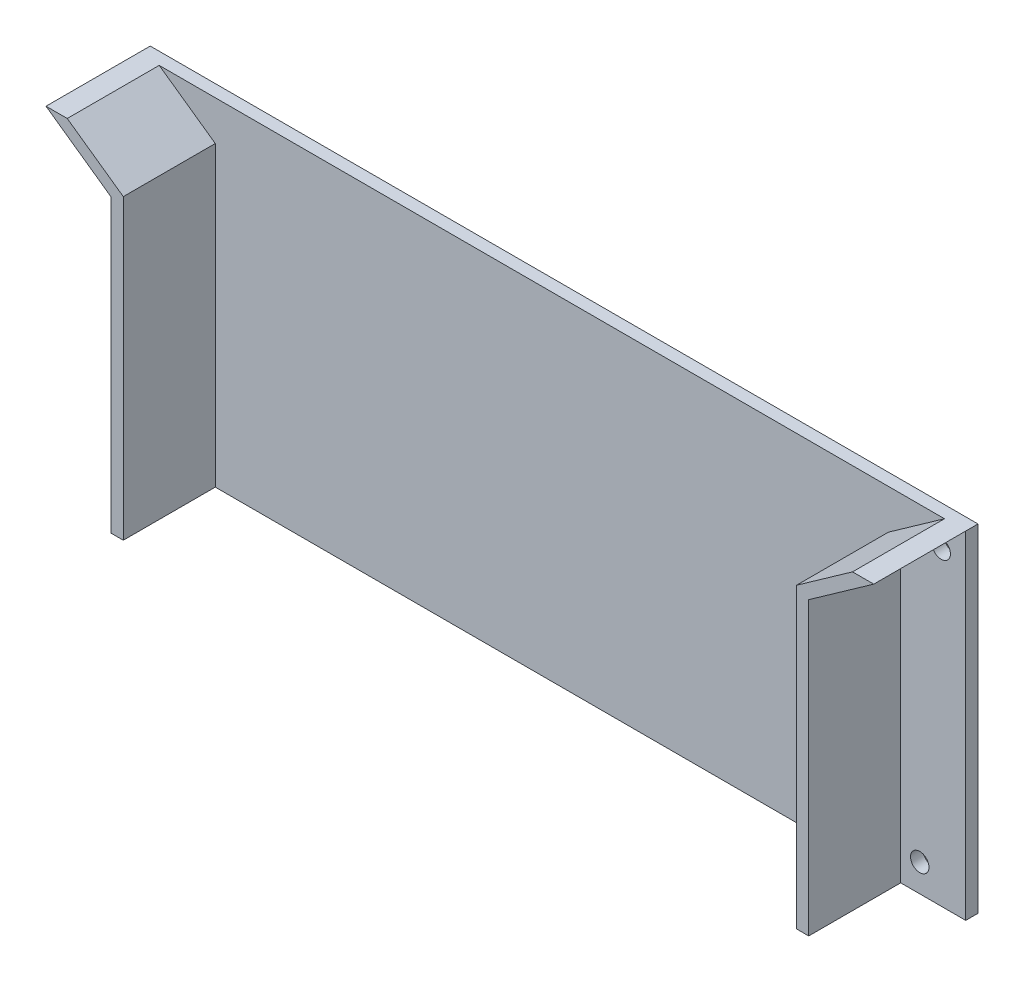
ISO-10303-21;
HEADER;
FILE_DESCRIPTION(('STEP AP214'),'2;1');
FILE_NAME('part.step','',(''),(''),'','','');
FILE_SCHEMA(('AUTOMOTIVE_DESIGN { 1 0 10303 214 1 1 1 1 }'));
ENDSEC;
DATA;
#1=APPLICATION_CONTEXT('core data for automotive mechanical design processes');
#2=APPLICATION_PROTOCOL_DEFINITION('international standard','automotive_design',2000,#1);
#3=PRODUCT_CONTEXT('',#1,'mechanical');
#4=PRODUCT('Part','Part','',(#3));
#5=PRODUCT_RELATED_PRODUCT_CATEGORY('part','',(#4));
#6=PRODUCT_DEFINITION_FORMATION('','',#4);
#7=PRODUCT_DEFINITION_CONTEXT('part definition',#1,'design');
#8=PRODUCT_DEFINITION('design','',#6,#7);
#9=PRODUCT_DEFINITION_SHAPE('','',#8);
#10=(LENGTH_UNIT() NAMED_UNIT(*) SI_UNIT(.MILLI.,.METRE.));
#11=(NAMED_UNIT(*) PLANE_ANGLE_UNIT() SI_UNIT($,.RADIAN.));
#12=(NAMED_UNIT(*) SI_UNIT($,.STERADIAN.) SOLID_ANGLE_UNIT());
#13=UNCERTAINTY_MEASURE_WITH_UNIT(LENGTH_MEASURE(1.E-05),#10,'distance_accuracy_value','');
#14=(GEOMETRIC_REPRESENTATION_CONTEXT(3) GLOBAL_UNCERTAINTY_ASSIGNED_CONTEXT((#13)) GLOBAL_UNIT_ASSIGNED_CONTEXT((#10,
#11,#12)) REPRESENTATION_CONTEXT('',''));
#15=CARTESIAN_POINT('',(0.,0.,0.));
#16=DIRECTION('',(0.,0.,1.));
#17=DIRECTION('',(1.,0.,0.));
#18=AXIS2_PLACEMENT_3D('',#15,#16,#17);
#19=CARTESIAN_POINT('',(0.,0.,4.));
#20=DIRECTION('',(0.,0.,1.));
#21=DIRECTION('',(1.,0.,0.));
#22=AXIS2_PLACEMENT_3D('',#19,#20,#21);
#23=PLANE('',#22);
#24=DIRECTION('',(-0.816523227975285,0.577312582728647,0.));
#25=VECTOR('',#24,1.);
#26=CARTESIAN_POINT('',(-128.071344502671,55.,4.));
#27=LINE('',#26,#25);
#28=CARTESIAN_POINT('',(-109.784719429221,42.0706694079946,4.));
#29=VERTEX_POINT('',#28);
#30=CARTESIAN_POINT('',(-128.071344502671,55.,4.));
#31=VERTEX_POINT('',#30);
#32=EDGE_CURVE('E182',#29,#31,#27,.T.);
#33=ORIENTED_EDGE('',*,*,#32,.F.);
#34=DIRECTION('',(0.,1.,0.));
#35=VECTOR('',#34,1.);
#36=CARTESIAN_POINT('',(-109.784719429221,42.0706694079946,4.));
#37=LINE('',#36,#35);
#38=CARTESIAN_POINT('',(-109.784719429221,-55.,4.));
#39=VERTEX_POINT('',#38);
#40=EDGE_CURVE('E185',#39,#29,#37,.T.);
#41=ORIENTED_EDGE('',*,*,#40,.F.);
#42=DIRECTION('',(1.,0.,0.));
#43=VECTOR('',#42,1.);
#44=CARTESIAN_POINT('',(-135.,-55.,4.));
#45=LINE('',#44,#43);
#46=CARTESIAN_POINT('',(109.784719429221,-55.,4.));
#47=VERTEX_POINT('',#46);
#48=EDGE_CURVE('E246',#39,#47,#45,.T.);
#49=ORIENTED_EDGE('',*,*,#48,.T.);
#50=DIRECTION('',(0.,-1.,0.));
#51=VECTOR('',#50,1.);
#52=CARTESIAN_POINT('',(109.784719429221,42.0706694079946,4.));
#53=LINE('',#52,#51);
#54=CARTESIAN_POINT('',(109.784719429221,42.0706694079946,4.));
#55=VERTEX_POINT('',#54);
#56=EDGE_CURVE('E281',#55,#47,#53,.T.);
#57=ORIENTED_EDGE('',*,*,#56,.F.);
#58=DIRECTION('',(-0.816523227975285,-0.577312582728647,0.));
#59=VECTOR('',#58,1.);
#60=CARTESIAN_POINT('',(128.071344502671,55.,4.));
#61=LINE('',#60,#59);
#62=CARTESIAN_POINT('',(128.071344502671,55.0000000000001,4.));
#63=VERTEX_POINT('',#62);
#64=EDGE_CURVE('E284',#63,#55,#61,.T.);
#65=ORIENTED_EDGE('',*,*,#64,.F.);
#66=DIRECTION('',(-1.,0.,0.));
#67=VECTOR('',#66,1.);
#68=CARTESIAN_POINT('',(-135.,55.,4.));
#69=LINE('',#68,#67);
#70=EDGE_CURVE('E250',#63,#31,#69,.T.);
#71=ORIENTED_EDGE('',*,*,#70,.T.);
#72=EDGE_LOOP('',(#33,#41,#49,#57,#65,#71));
#73=FACE_BOUND('',#72,.T.);
#74=ADVANCED_FACE('F33',(#73),#23,.T.);
#75=CARTESIAN_POINT('',(-127.,46.,4.));
#76=DIRECTION('',(0.,0.,1.));
#77=DIRECTION('',(1.,0.,0.));
#78=AXIS2_PLACEMENT_3D('',#75,#76,#77);
#79=CIRCLE('',#78,3.00000000000001);
#80=CARTESIAN_POINT('',(-126.43905459309,48.9470901327354,4.));
#81=VERTEX_POINT('',#80);
#82=CARTESIAN_POINT('',(-124.408578092933,47.5114670024764,4.));
#83=VERTEX_POINT('',#82);
#84=EDGE_CURVE('E163',#81,#83,#79,.T.);
#85=ORIENTED_EDGE('',*,*,#84,.F.);
#86=DIRECTION('',(0.816523227975285,-0.577312582728647,0.));
#87=VECTOR('',#86,1.);
#88=CARTESIAN_POINT('',(-135.,55.,4.));
#89=LINE('',#88,#87);
#90=CARTESIAN_POINT('',(-135.,55.,4.));
#91=VERTEX_POINT('',#90);
#92=EDGE_CURVE('E156',#91,#81,#89,.T.);
#93=ORIENTED_EDGE('',*,*,#92,.F.);
#94=DIRECTION('',(0.,-1.,0.));
#95=VECTOR('',#94,1.);
#96=CARTESIAN_POINT('',(-135.,55.,4.));
#97=LINE('',#96,#95);
#98=CARTESIAN_POINT('',(-135.,-55.,4.));
#99=VERTEX_POINT('',#98);
#100=EDGE_CURVE('E248',#91,#99,#97,.T.);
#101=ORIENTED_EDGE('',*,*,#100,.T.);
#102=CARTESIAN_POINT('',(-113.784719429221,-55.,4.));
#103=VERTEX_POINT('',#102);
#104=EDGE_CURVE('E233',#99,#103,#45,.T.);
#105=ORIENTED_EDGE('',*,*,#104,.T.);
#106=DIRECTION('',(0.,-1.,0.));
#107=VECTOR('',#106,1.);
#108=CARTESIAN_POINT('',(-113.784719429221,40.,4.));
#109=LINE('',#108,#107);
#110=CARTESIAN_POINT('',(-113.784719429221,40.,4.));
#111=VERTEX_POINT('',#110);
#112=EDGE_CURVE('E177',#111,#103,#109,.T.);
#113=ORIENTED_EDGE('',*,*,#112,.F.);
#114=EDGE_CURVE('E157',#83,#111,#89,.T.);
#115=ORIENTED_EDGE('',*,*,#114,.F.);
#116=EDGE_LOOP('',(#85,#93,#101,#105,#113,#115));
#117=FACE_BOUND('',#116,.T.);
#118=CARTESIAN_POINT('',(-120.,-46.,4.));
#119=DIRECTION('',(0.,0.,1.));
#120=DIRECTION('',(1.,0.,0.));
#121=AXIS2_PLACEMENT_3D('',#118,#119,#120);
#122=CIRCLE('',#121,3.00000000000001);
#123=CARTESIAN_POINT('',(-117.,-46.,4.));
#124=VERTEX_POINT('',#123);
#125=EDGE_CURVE('E207',#124,#124,#122,.T.);
#126=ORIENTED_EDGE('',*,*,#125,.F.);
#127=EDGE_LOOP('',(#126));
#128=FACE_BOUND('',#127,.T.);
#129=ADVANCED_FACE('F168',(#117,#128),#23,.T.);
#130=CARTESIAN_POINT('',(120.,-46.,4.));
#131=DIRECTION('',(0.,0.,1.));
#132=DIRECTION('',(1.,0.,0.));
#133=AXIS2_PLACEMENT_3D('',#130,#131,#132);
#134=CIRCLE('',#133,3.00000000000002);
#135=CARTESIAN_POINT('',(123.,-46.,4.));
#136=VERTEX_POINT('',#135);
#137=EDGE_CURVE('E211',#136,#136,#134,.T.);
#138=ORIENTED_EDGE('',*,*,#137,.F.);
#139=EDGE_LOOP('',(#138));
#140=FACE_BOUND('',#139,.T.);
#141=CARTESIAN_POINT('',(127.,46.,4.));
#142=DIRECTION('',(0.,0.,1.));
#143=DIRECTION('',(1.,0.,0.));
#144=AXIS2_PLACEMENT_3D('',#141,#142,#143);
#145=CIRCLE('',#144,2.99999999999999);
#146=CARTESIAN_POINT('',(124.408578092933,47.5114670024763,4.));
#147=VERTEX_POINT('',#146);
#148=CARTESIAN_POINT('',(126.43905459309,48.9470901327353,4.));
#149=VERTEX_POINT('',#148);
#150=EDGE_CURVE('E165',#147,#149,#145,.T.);
#151=ORIENTED_EDGE('',*,*,#150,.F.);
#152=DIRECTION('',(0.816523227975285,0.577312582728647,0.));
#153=VECTOR('',#152,1.);
#154=CARTESIAN_POINT('',(135.,55.,4.));
#155=LINE('',#154,#153);
#156=CARTESIAN_POINT('',(113.784719429221,40.,4.));
#157=VERTEX_POINT('',#156);
#158=EDGE_CURVE('E272',#157,#147,#155,.T.);
#159=ORIENTED_EDGE('',*,*,#158,.F.);
#160=DIRECTION('',(0.,1.,0.));
#161=VECTOR('',#160,1.);
#162=CARTESIAN_POINT('',(113.784719429221,40.,4.));
#163=LINE('',#162,#161);
#164=CARTESIAN_POINT('',(113.784719429221,-55.,4.));
#165=VERTEX_POINT('',#164);
#166=EDGE_CURVE('E278',#165,#157,#163,.T.);
#167=ORIENTED_EDGE('',*,*,#166,.F.);
#168=CARTESIAN_POINT('',(135.,-55.,4.));
#169=VERTEX_POINT('',#168);
#170=EDGE_CURVE('E247',#165,#169,#45,.T.);
#171=ORIENTED_EDGE('',*,*,#170,.T.);
#172=DIRECTION('',(0.,1.,0.));
#173=VECTOR('',#172,1.);
#174=CARTESIAN_POINT('',(135.,55.,4.));
#175=LINE('',#174,#173);
#176=CARTESIAN_POINT('',(135.,55.,4.));
#177=VERTEX_POINT('',#176);
#178=EDGE_CURVE('E236',#169,#177,#175,.T.);
#179=ORIENTED_EDGE('',*,*,#178,.T.);
#180=EDGE_CURVE('E277',#149,#177,#155,.T.);
#181=ORIENTED_EDGE('',*,*,#180,.F.);
#182=EDGE_LOOP('',(#151,#159,#167,#171,#179,#181));
#183=FACE_BOUND('',#182,.T.);
#184=ADVANCED_FACE('F349',(#140,#183),#23,.T.);
#185=CARTESIAN_POINT('',(135.,55.,4.));
#186=DIRECTION('',(-1.,0.,0.));
#187=DIRECTION('',(0.,-1.,0.));
#188=AXIS2_PLACEMENT_3D('',#185,#186,#187);
#189=PLANE('',#188);
#190=DIRECTION('',(0.,1.,0.));
#191=VECTOR('',#190,1.);
#192=CARTESIAN_POINT('',(135.,55.,0.));
#193=LINE('',#192,#191);
#194=CARTESIAN_POINT('',(135.,-55.,0.));
#195=VERTEX_POINT('',#194);
#196=CARTESIAN_POINT('',(135.,55.,0.));
#197=VERTEX_POINT('',#196);
#198=EDGE_CURVE('E241',#195,#197,#193,.T.);
#199=ORIENTED_EDGE('',*,*,#198,.T.);
#200=DIRECTION('',(0.,0.,-1.));
#201=VECTOR('',#200,1.);
#202=CARTESIAN_POINT('',(135.,55.,4.));
#203=LINE('',#202,#201);
#204=EDGE_CURVE('E11',#177,#197,#203,.T.);
#205=ORIENTED_EDGE('',*,*,#204,.F.);
#206=ORIENTED_EDGE('',*,*,#178,.F.);
#207=DIRECTION('',(0.,0.,-1.));
#208=VECTOR('',#207,1.);
#209=CARTESIAN_POINT('',(135.,-55.,4.));
#210=LINE('',#209,#208);
#211=EDGE_CURVE('E230',#169,#195,#210,.T.);
#212=ORIENTED_EDGE('',*,*,#211,.T.);
#213=EDGE_LOOP('',(#199,#205,#206,#212));
#214=FACE_BOUND('',#213,.T.);
#215=ADVANCED_FACE('F35',(#214),#189,.F.);
#216=CARTESIAN_POINT('',(-135.,55.,4.));
#217=DIRECTION('',(0.,-1.,0.));
#218=DIRECTION('',(0.,0.,-1.));
#219=AXIS2_PLACEMENT_3D('',#216,#217,#218);
#220=PLANE('',#219);
#221=DIRECTION('',(-1.,0.,0.));
#222=VECTOR('',#221,1.);
#223=CARTESIAN_POINT('',(-135.,55.,0.));
#224=LINE('',#223,#222);
#225=CARTESIAN_POINT('',(-135.,55.,0.));
#226=VERTEX_POINT('',#225);
#227=EDGE_CURVE('E239',#197,#226,#224,.T.);
#228=ORIENTED_EDGE('',*,*,#227,.T.);
#229=DIRECTION('',(0.,0.,-1.));
#230=VECTOR('',#229,1.);
#231=CARTESIAN_POINT('',(-135.,55.,4.));
#232=LINE('',#231,#230);
#233=EDGE_CURVE('E42',#91,#226,#232,.T.);
#234=ORIENTED_EDGE('',*,*,#233,.F.);
#235=DIRECTION('',(0.,0.,-1.));
#236=VECTOR('',#235,1.);
#237=CARTESIAN_POINT('',(-135.,55.,34.));
#238=LINE('',#237,#236);
#239=CARTESIAN_POINT('',(-135.,55.,34.));
#240=VERTEX_POINT('',#239);
#241=EDGE_CURVE('E176',#240,#91,#238,.T.);
#242=ORIENTED_EDGE('',*,*,#241,.F.);
#243=DIRECTION('',(-1.,0.,0.));
#244=VECTOR('',#243,1.);
#245=CARTESIAN_POINT('',(-128.071344502671,55.,34.));
#246=LINE('',#245,#244);
#247=CARTESIAN_POINT('',(-128.071344502671,55.,34.));
#248=VERTEX_POINT('',#247);
#249=EDGE_CURVE('E201',#248,#240,#246,.T.);
#250=ORIENTED_EDGE('',*,*,#249,.F.);
#251=DIRECTION('',(0.,0.,-1.));
#252=VECTOR('',#251,1.);
#253=CARTESIAN_POINT('',(-128.071344502671,55.,34.));
#254=LINE('',#253,#252);
#255=EDGE_CURVE('E300',#248,#31,#254,.T.);
#256=ORIENTED_EDGE('',*,*,#255,.T.);
#257=ORIENTED_EDGE('',*,*,#70,.F.);
#258=DIRECTION('',(0.,0.,-1.));
#259=VECTOR('',#258,1.);
#260=CARTESIAN_POINT('',(128.071344502671,55.,34.));
#261=LINE('',#260,#259);
#262=CARTESIAN_POINT('',(128.071344502671,55.,34.));
#263=VERTEX_POINT('',#262);
#264=EDGE_CURVE('E244',#263,#63,#261,.T.);
#265=ORIENTED_EDGE('',*,*,#264,.F.);
#266=DIRECTION('',(-1.,0.,0.));
#267=VECTOR('',#266,1.);
#268=CARTESIAN_POINT('',(128.071344502671,55.,34.));
#269=LINE('',#268,#267);
#270=CARTESIAN_POINT('',(135.,55.,34.));
#271=VERTEX_POINT('',#270);
#272=EDGE_CURVE('E275',#271,#263,#269,.T.);
#273=ORIENTED_EDGE('',*,*,#272,.F.);
#274=DIRECTION('',(0.,0.,-1.));
#275=VECTOR('',#274,1.);
#276=CARTESIAN_POINT('',(135.,55.,34.));
#277=LINE('',#276,#275);
#278=EDGE_CURVE('E268',#271,#177,#277,.T.);
#279=ORIENTED_EDGE('',*,*,#278,.T.);
#280=ORIENTED_EDGE('',*,*,#204,.T.);
#281=EDGE_LOOP('',(#228,#234,#242,#250,#256,#257,#265,#273,#279,#280));
#282=FACE_BOUND('',#281,.T.);
#283=ADVANCED_FACE('F369',(#282),#220,.F.);
#284=CARTESIAN_POINT('',(-135.,55.,4.));
#285=DIRECTION('',(1.,0.,0.));
#286=DIRECTION('',(0.,1.,0.));
#287=AXIS2_PLACEMENT_3D('',#284,#285,#286);
#288=PLANE('',#287);
#289=DIRECTION('',(0.,-1.,0.));
#290=VECTOR('',#289,1.);
#291=CARTESIAN_POINT('',(-135.,55.,0.));
#292=LINE('',#291,#290);
#293=CARTESIAN_POINT('',(-135.,-55.,0.));
#294=VERTEX_POINT('',#293);
#295=EDGE_CURVE('E237',#226,#294,#292,.T.);
#296=ORIENTED_EDGE('',*,*,#295,.T.);
#297=DIRECTION('',(0.,0.,-1.));
#298=VECTOR('',#297,1.);
#299=CARTESIAN_POINT('',(-135.,-55.,4.));
#300=LINE('',#299,#298);
#301=EDGE_CURVE('E227',#99,#294,#300,.T.);
#302=ORIENTED_EDGE('',*,*,#301,.F.);
#303=ORIENTED_EDGE('',*,*,#100,.F.);
#304=ORIENTED_EDGE('',*,*,#233,.T.);
#305=EDGE_LOOP('',(#296,#302,#303,#304));
#306=FACE_BOUND('',#305,.T.);
#307=ADVANCED_FACE('F336',(#306),#288,.F.);
#308=CARTESIAN_POINT('',(-135.,-55.,4.));
#309=DIRECTION('',(0.,1.,0.));
#310=DIRECTION('',(0.,0.,1.));
#311=AXIS2_PLACEMENT_3D('',#308,#309,#310);
#312=PLANE('',#311);
#313=DIRECTION('',(1.,0.,0.));
#314=VECTOR('',#313,1.);
#315=CARTESIAN_POINT('',(-135.,-55.,0.));
#316=LINE('',#315,#314);
#317=EDGE_CURVE('E234',#294,#195,#316,.T.);
#318=ORIENTED_EDGE('',*,*,#317,.T.);
#319=ORIENTED_EDGE('',*,*,#211,.F.);
#320=ORIENTED_EDGE('',*,*,#170,.F.);
#321=DIRECTION('',(0.,0.,-1.));
#322=VECTOR('',#321,1.);
#323=CARTESIAN_POINT('',(113.784719429221,-55.,34.));
#324=LINE('',#323,#322);
#325=CARTESIAN_POINT('',(113.784719429221,-55.,34.));
#326=VERTEX_POINT('',#325);
#327=EDGE_CURVE('E262',#326,#165,#324,.T.);
#328=ORIENTED_EDGE('',*,*,#327,.F.);
#329=DIRECTION('',(1.,0.,0.));
#330=VECTOR('',#329,1.);
#331=CARTESIAN_POINT('',(113.784719429221,-55.,34.));
#332=LINE('',#331,#330);
#333=CARTESIAN_POINT('',(109.784719429221,-55.,34.));
#334=VERTEX_POINT('',#333);
#335=EDGE_CURVE('E291',#334,#326,#332,.T.);
#336=ORIENTED_EDGE('',*,*,#335,.F.);
#337=DIRECTION('',(0.,0.,-1.));
#338=VECTOR('',#337,1.);
#339=CARTESIAN_POINT('',(109.784719429221,-55.,34.));
#340=LINE('',#339,#338);
#341=EDGE_CURVE('E259',#334,#47,#340,.T.);
#342=ORIENTED_EDGE('',*,*,#341,.T.);
#343=ORIENTED_EDGE('',*,*,#48,.F.);
#344=DIRECTION('',(0.,0.,-1.));
#345=VECTOR('',#344,1.);
#346=CARTESIAN_POINT('',(-109.784719429221,-55.,34.));
#347=LINE('',#346,#345);
#348=CARTESIAN_POINT('',(-109.784719429221,-55.,34.));
#349=VERTEX_POINT('',#348);
#350=EDGE_CURVE('E196',#349,#39,#347,.T.);
#351=ORIENTED_EDGE('',*,*,#350,.F.);
#352=DIRECTION('',(1.,0.,0.));
#353=VECTOR('',#352,1.);
#354=CARTESIAN_POINT('',(-113.784719429221,-55.,34.));
#355=LINE('',#354,#353);
#356=CARTESIAN_POINT('',(-113.784719429221,-55.,34.));
#357=VERTEX_POINT('',#356);
#358=EDGE_CURVE('E194',#357,#349,#355,.T.);
#359=ORIENTED_EDGE('',*,*,#358,.F.);
#360=DIRECTION('',(0.,0.,-1.));
#361=VECTOR('',#360,1.);
#362=CARTESIAN_POINT('',(-113.784719429221,-55.,34.));
#363=LINE('',#362,#361);
#364=EDGE_CURVE('E306',#357,#103,#363,.T.);
#365=ORIENTED_EDGE('',*,*,#364,.T.);
#366=ORIENTED_EDGE('',*,*,#104,.F.);
#367=ORIENTED_EDGE('',*,*,#301,.T.);
#368=EDGE_LOOP('',(#318,#319,#320,#328,#336,#342,#343,#351,#359,#365,#366,#367));
#369=FACE_BOUND('',#368,.T.);
#370=ADVANCED_FACE('F318',(#369),#312,.F.);
#371=CARTESIAN_POINT('',(0.,0.,0.));
#372=DIRECTION('',(0.,0.,1.));
#373=DIRECTION('',(1.,0.,0.));
#374=AXIS2_PLACEMENT_3D('',#371,#372,#373);
#375=PLANE('',#374);
#376=CARTESIAN_POINT('',(120.,-46.,0.));
#377=DIRECTION('',(0.,0.,1.));
#378=DIRECTION('',(1.,0.,0.));
#379=AXIS2_PLACEMENT_3D('',#376,#377,#378);
#380=CIRCLE('',#379,3.00000000000002);
#381=CARTESIAN_POINT('',(123.,-46.,0.));
#382=VERTEX_POINT('',#381);
#383=EDGE_CURVE('E37',#382,#382,#380,.T.);
#384=ORIENTED_EDGE('',*,*,#383,.T.);
#385=EDGE_LOOP('',(#384));
#386=FACE_BOUND('',#385,.T.);
#387=CARTESIAN_POINT('',(127.,46.,0.));
#388=DIRECTION('',(0.,0.,1.));
#389=DIRECTION('',(1.,0.,0.));
#390=AXIS2_PLACEMENT_3D('',#387,#388,#389);
#391=CIRCLE('',#390,2.99999999999999);
#392=CARTESIAN_POINT('',(130.,46.,0.));
#393=VERTEX_POINT('',#392);
#394=EDGE_CURVE('E217',#393,#393,#391,.T.);
#395=ORIENTED_EDGE('',*,*,#394,.T.);
#396=EDGE_LOOP('',(#395));
#397=FACE_BOUND('',#396,.T.);
#398=CARTESIAN_POINT('',(-127.,46.,0.));
#399=DIRECTION('',(0.,0.,1.));
#400=DIRECTION('',(1.,0.,0.));
#401=AXIS2_PLACEMENT_3D('',#398,#399,#400);
#402=CIRCLE('',#401,3.00000000000001);
#403=CARTESIAN_POINT('',(-124.,46.,0.));
#404=VERTEX_POINT('',#403);
#405=EDGE_CURVE('E213',#404,#404,#402,.T.);
#406=ORIENTED_EDGE('',*,*,#405,.T.);
#407=EDGE_LOOP('',(#406));
#408=FACE_BOUND('',#407,.T.);
#409=CARTESIAN_POINT('',(-120.,-46.,0.));
#410=DIRECTION('',(0.,0.,1.));
#411=DIRECTION('',(1.,0.,0.));
#412=AXIS2_PLACEMENT_3D('',#409,#410,#411);
#413=CIRCLE('',#412,3.00000000000001);
#414=CARTESIAN_POINT('',(-117.,-46.,0.));
#415=VERTEX_POINT('',#414);
#416=EDGE_CURVE('E191',#415,#415,#413,.T.);
#417=ORIENTED_EDGE('',*,*,#416,.T.);
#418=EDGE_LOOP('',(#417));
#419=FACE_BOUND('',#418,.T.);
#420=ORIENTED_EDGE('',*,*,#198,.F.);
#421=ORIENTED_EDGE('',*,*,#317,.F.);
#422=ORIENTED_EDGE('',*,*,#295,.F.);
#423=ORIENTED_EDGE('',*,*,#227,.F.);
#424=EDGE_LOOP('',(#420,#421,#422,#423));
#425=FACE_BOUND('',#424,.T.);
#426=ADVANCED_FACE('F340',(#386,#397,#408,#419,#425),#375,.F.);
#427=CARTESIAN_POINT('',(128.071344502671,55.,34.));
#428=DIRECTION('',(0.577312582728647,-0.816523227975285,0.));
#429=DIRECTION('',(0.816523227975285,0.577312582728647,0.));
#430=AXIS2_PLACEMENT_3D('',#427,#428,#429);
#431=PLANE('',#430);
#432=ORIENTED_EDGE('',*,*,#64,.T.);
#433=DIRECTION('',(0.,0.,-1.));
#434=VECTOR('',#433,1.);
#435=CARTESIAN_POINT('',(109.784719429221,42.0706694079946,34.));
#436=LINE('',#435,#434);
#437=CARTESIAN_POINT('',(109.784719429221,42.0706694079946,34.));
#438=VERTEX_POINT('',#437);
#439=EDGE_CURVE('E256',#438,#55,#436,.T.);
#440=ORIENTED_EDGE('',*,*,#439,.F.);
#441=DIRECTION('',(-0.816523227975285,-0.577312582728647,0.));
#442=VECTOR('',#441,1.);
#443=CARTESIAN_POINT('',(128.071344502671,55.,34.));
#444=LINE('',#443,#442);
#445=EDGE_CURVE('E295',#263,#438,#444,.T.);
#446=ORIENTED_EDGE('',*,*,#445,.F.);
#447=ORIENTED_EDGE('',*,*,#264,.T.);
#448=EDGE_LOOP('',(#432,#440,#446,#447));
#449=FACE_BOUND('',#448,.T.);
#450=ADVANCED_FACE('F365',(#449),#431,.F.);
#451=CARTESIAN_POINT('',(109.784719429221,42.0706694079946,34.));
#452=DIRECTION('',(1.,0.,0.));
#453=DIRECTION('',(0.,1.,0.));
#454=AXIS2_PLACEMENT_3D('',#451,#452,#453);
#455=PLANE('',#454);
#456=ORIENTED_EDGE('',*,*,#56,.T.);
#457=ORIENTED_EDGE('',*,*,#341,.F.);
#458=DIRECTION('',(0.,-1.,0.));
#459=VECTOR('',#458,1.);
#460=CARTESIAN_POINT('',(109.784719429221,42.0706694079946,34.));
#461=LINE('',#460,#459);
#462=EDGE_CURVE('E293',#438,#334,#461,.T.);
#463=ORIENTED_EDGE('',*,*,#462,.F.);
#464=ORIENTED_EDGE('',*,*,#439,.T.);
#465=EDGE_LOOP('',(#456,#457,#463,#464));
#466=FACE_BOUND('',#465,.T.);
#467=ADVANCED_FACE('F363',(#466),#455,.F.);
#468=CARTESIAN_POINT('',(113.784719429221,40.,34.));
#469=DIRECTION('',(-1.,0.,0.));
#470=DIRECTION('',(0.,-1.,0.));
#471=AXIS2_PLACEMENT_3D('',#468,#469,#470);
#472=PLANE('',#471);
#473=ORIENTED_EDGE('',*,*,#166,.T.);
#474=DIRECTION('',(0.,0.,-1.));
#475=VECTOR('',#474,1.);
#476=CARTESIAN_POINT('',(113.784719429221,40.,34.));
#477=LINE('',#476,#475);
#478=CARTESIAN_POINT('',(113.784719429221,40.,34.));
#479=VERTEX_POINT('',#478);
#480=EDGE_CURVE('E265',#479,#157,#477,.T.);
#481=ORIENTED_EDGE('',*,*,#480,.F.);
#482=DIRECTION('',(0.,1.,0.));
#483=VECTOR('',#482,1.);
#484=CARTESIAN_POINT('',(113.784719429221,40.,34.));
#485=LINE('',#484,#483);
#486=EDGE_CURVE('E289',#326,#479,#485,.T.);
#487=ORIENTED_EDGE('',*,*,#486,.F.);
#488=ORIENTED_EDGE('',*,*,#327,.T.);
#489=EDGE_LOOP('',(#473,#481,#487,#488));
#490=FACE_BOUND('',#489,.T.);
#491=ADVANCED_FACE('F354',(#490),#472,.F.);
#492=CARTESIAN_POINT('',(135.,55.,34.));
#493=DIRECTION('',(-0.577312582728647,0.816523227975285,0.));
#494=DIRECTION('',(-0.816523227975285,-0.577312582728647,0.));
#495=AXIS2_PLACEMENT_3D('',#492,#493,#494);
#496=PLANE('',#495);
#497=ORIENTED_EDGE('',*,*,#158,.T.);
#498=EDGE_CURVE('E276',#147,#149,#155,.T.);
#499=ORIENTED_EDGE('',*,*,#498,.T.);
#500=ORIENTED_EDGE('',*,*,#180,.T.);
#501=ORIENTED_EDGE('',*,*,#278,.F.);
#502=DIRECTION('',(0.816523227975285,0.577312582728647,0.));
#503=VECTOR('',#502,1.);
#504=CARTESIAN_POINT('',(135.,55.,34.));
#505=LINE('',#504,#503);
#506=EDGE_CURVE('E271',#479,#271,#505,.T.);
#507=ORIENTED_EDGE('',*,*,#506,.F.);
#508=ORIENTED_EDGE('',*,*,#480,.T.);
#509=EDGE_LOOP('',(#497,#499,#500,#501,#507,#508));
#510=FACE_BOUND('',#509,.T.);
#511=ADVANCED_FACE('F371',(#510),#496,.F.);
#512=CARTESIAN_POINT('',(0.,0.,34.));
#513=DIRECTION('',(0.,0.,-1.));
#514=DIRECTION('',(-1.,0.,0.));
#515=AXIS2_PLACEMENT_3D('',#512,#513,#514);
#516=PLANE('',#515);
#517=ORIENTED_EDGE('',*,*,#272,.T.);
#518=ORIENTED_EDGE('',*,*,#445,.T.);
#519=ORIENTED_EDGE('',*,*,#462,.T.);
#520=ORIENTED_EDGE('',*,*,#335,.T.);
#521=ORIENTED_EDGE('',*,*,#486,.T.);
#522=ORIENTED_EDGE('',*,*,#506,.T.);
#523=EDGE_LOOP('',(#517,#518,#519,#520,#521,#522));
#524=FACE_BOUND('',#523,.T.);
#525=ADVANCED_FACE('F358',(#524),#516,.F.);
#526=CARTESIAN_POINT('',(-109.784719429221,42.0706694079946,34.));
#527=DIRECTION('',(-1.,0.,0.));
#528=DIRECTION('',(0.,-1.,0.));
#529=AXIS2_PLACEMENT_3D('',#526,#527,#528);
#530=PLANE('',#529);
#531=ORIENTED_EDGE('',*,*,#40,.T.);
#532=DIRECTION('',(0.,0.,-1.));
#533=VECTOR('',#532,1.);
#534=CARTESIAN_POINT('',(-109.784719429221,42.0706694079946,34.));
#535=LINE('',#534,#533);
#536=CARTESIAN_POINT('',(-109.784719429221,42.0706694079946,34.));
#537=VERTEX_POINT('',#536);
#538=EDGE_CURVE('E287',#537,#29,#535,.T.);
#539=ORIENTED_EDGE('',*,*,#538,.F.);
#540=DIRECTION('',(0.,1.,0.));
#541=VECTOR('',#540,1.);
#542=CARTESIAN_POINT('',(-109.784719429221,42.0706694079946,34.));
#543=LINE('',#542,#541);
#544=EDGE_CURVE('E179',#349,#537,#543,.T.);
#545=ORIENTED_EDGE('',*,*,#544,.F.);
#546=ORIENTED_EDGE('',*,*,#350,.T.);
#547=EDGE_LOOP('',(#531,#539,#545,#546));
#548=FACE_BOUND('',#547,.T.);
#549=ADVANCED_FACE('F313',(#548),#530,.F.);
#550=CARTESIAN_POINT('',(-128.071344502671,55.,34.));
#551=DIRECTION('',(-0.577312582728647,-0.816523227975285,0.));
#552=DIRECTION('',(0.816523227975285,-0.577312582728647,0.));
#553=AXIS2_PLACEMENT_3D('',#550,#551,#552);
#554=PLANE('',#553);
#555=ORIENTED_EDGE('',*,*,#32,.T.);
#556=ORIENTED_EDGE('',*,*,#255,.F.);
#557=DIRECTION('',(-0.816523227975285,0.577312582728647,0.));
#558=VECTOR('',#557,1.);
#559=CARTESIAN_POINT('',(-128.071344502671,55.,34.));
#560=LINE('',#559,#558);
#561=EDGE_CURVE('E203',#537,#248,#560,.T.);
#562=ORIENTED_EDGE('',*,*,#561,.F.);
#563=ORIENTED_EDGE('',*,*,#538,.T.);
#564=EDGE_LOOP('',(#555,#556,#562,#563));
#565=FACE_BOUND('',#564,.T.);
#566=ADVANCED_FACE('F323',(#565),#554,.F.);
#567=CARTESIAN_POINT('',(-135.,55.,34.));
#568=DIRECTION('',(0.577312582728647,0.816523227975285,0.));
#569=DIRECTION('',(-0.816523227975285,0.577312582728647,0.));
#570=AXIS2_PLACEMENT_3D('',#567,#568,#569);
#571=PLANE('',#570);
#572=ORIENTED_EDGE('',*,*,#92,.T.);
#573=EDGE_CURVE('E152',#81,#83,#89,.T.);
#574=ORIENTED_EDGE('',*,*,#573,.T.);
#575=ORIENTED_EDGE('',*,*,#114,.T.);
#576=DIRECTION('',(0.,0.,-1.));
#577=VECTOR('',#576,1.);
#578=CARTESIAN_POINT('',(-113.784719429221,40.,34.));
#579=LINE('',#578,#577);
#580=CARTESIAN_POINT('',(-113.784719429221,40.,34.));
#581=VERTEX_POINT('',#580);
#582=EDGE_CURVE('E303',#581,#111,#579,.T.);
#583=ORIENTED_EDGE('',*,*,#582,.F.);
#584=DIRECTION('',(0.816523227975285,-0.577312582728647,0.));
#585=VECTOR('',#584,1.);
#586=CARTESIAN_POINT('',(-135.,55.,34.));
#587=LINE('',#586,#585);
#588=EDGE_CURVE('E199',#240,#581,#587,.T.);
#589=ORIENTED_EDGE('',*,*,#588,.F.);
#590=ORIENTED_EDGE('',*,*,#241,.T.);
#591=EDGE_LOOP('',(#572,#574,#575,#583,#589,#590));
#592=FACE_BOUND('',#591,.T.);
#593=ADVANCED_FACE('F173',(#592),#571,.F.);
#594=CARTESIAN_POINT('',(-113.784719429221,40.,34.));
#595=DIRECTION('',(1.,0.,0.));
#596=DIRECTION('',(0.,1.,0.));
#597=AXIS2_PLACEMENT_3D('',#594,#595,#596);
#598=PLANE('',#597);
#599=ORIENTED_EDGE('',*,*,#112,.T.);
#600=ORIENTED_EDGE('',*,*,#364,.F.);
#601=DIRECTION('',(0.,-1.,0.));
#602=VECTOR('',#601,1.);
#603=CARTESIAN_POINT('',(-113.784719429221,40.,34.));
#604=LINE('',#603,#602);
#605=EDGE_CURVE('E197',#581,#357,#604,.T.);
#606=ORIENTED_EDGE('',*,*,#605,.F.);
#607=ORIENTED_EDGE('',*,*,#582,.T.);
#608=EDGE_LOOP('',(#599,#600,#606,#607));
#609=FACE_BOUND('',#608,.T.);
#610=ADVANCED_FACE('F330',(#609),#598,.F.);
#611=CARTESIAN_POINT('',(0.,0.,34.));
#612=DIRECTION('',(0.,0.,1.));
#613=DIRECTION('',(1.,0.,0.));
#614=AXIS2_PLACEMENT_3D('',#611,#612,#613);
#615=PLANE('',#614);
#616=ORIENTED_EDGE('',*,*,#544,.T.);
#617=ORIENTED_EDGE('',*,*,#561,.T.);
#618=ORIENTED_EDGE('',*,*,#249,.T.);
#619=ORIENTED_EDGE('',*,*,#588,.T.);
#620=ORIENTED_EDGE('',*,*,#605,.T.);
#621=ORIENTED_EDGE('',*,*,#358,.T.);
#622=EDGE_LOOP('',(#616,#617,#618,#619,#620,#621));
#623=FACE_BOUND('',#622,.T.);
#624=ADVANCED_FACE('F326',(#623),#615,.T.);
#625=CARTESIAN_POINT('',(-120.,-46.,-26.));
#626=DIRECTION('',(0.,0.,1.));
#627=DIRECTION('',(1.,0.,0.));
#628=AXIS2_PLACEMENT_3D('',#625,#626,#627);
#629=CYLINDRICAL_SURFACE('',#628,3.00000000000001);
#630=ORIENTED_EDGE('',*,*,#125,.T.);
#631=EDGE_LOOP('',(#630));
#632=FACE_BOUND('',#631,.T.);
#633=ORIENTED_EDGE('',*,*,#416,.F.);
#634=EDGE_LOOP('',(#633));
#635=FACE_BOUND('',#634,.T.);
#636=ADVANCED_FACE('F386',(#632,#635),#629,.F.);
#637=CARTESIAN_POINT('',(-127.,46.,-26.));
#638=DIRECTION('',(0.,0.,1.));
#639=DIRECTION('',(1.,0.,0.));
#640=AXIS2_PLACEMENT_3D('',#637,#638,#639);
#641=CYLINDRICAL_SURFACE('',#640,3.00000000000001);
#642=EDGE_CURVE('E56',#83,#81,#79,.T.);
#643=ORIENTED_EDGE('',*,*,#642,.T.);
#644=ORIENTED_EDGE('',*,*,#84,.T.);
#645=EDGE_LOOP('',(#643,#644));
#646=FACE_BOUND('',#645,.T.);
#647=ORIENTED_EDGE('',*,*,#405,.F.);
#648=EDGE_LOOP('',(#647));
#649=FACE_BOUND('',#648,.T.);
#650=ADVANCED_FACE('F161',(#646,#649),#641,.F.);
#651=CARTESIAN_POINT('',(-127.,46.,4.));
#652=DIRECTION('',(0.,0.,1.));
#653=DIRECTION('',(1.,0.,0.));
#654=AXIS2_PLACEMENT_3D('',#651,#652,#653);
#655=PLANE('',#654);
#656=ORIENTED_EDGE('',*,*,#642,.F.);
#657=ORIENTED_EDGE('',*,*,#573,.F.);
#658=EDGE_LOOP('',(#656,#657));
#659=FACE_BOUND('',#658,.T.);
#660=ADVANCED_FACE('F153',(#659),#655,.F.);
#661=CARTESIAN_POINT('',(127.,46.,-26.));
#662=DIRECTION('',(0.,0.,1.));
#663=DIRECTION('',(1.,0.,0.));
#664=AXIS2_PLACEMENT_3D('',#661,#662,#663);
#665=CYLINDRICAL_SURFACE('',#664,2.99999999999999);
#666=EDGE_CURVE('E49',#149,#147,#145,.T.);
#667=ORIENTED_EDGE('',*,*,#666,.T.);
#668=ORIENTED_EDGE('',*,*,#150,.T.);
#669=EDGE_LOOP('',(#667,#668));
#670=FACE_BOUND('',#669,.T.);
#671=ORIENTED_EDGE('',*,*,#394,.F.);
#672=EDGE_LOOP('',(#671));
#673=FACE_BOUND('',#672,.T.);
#674=ADVANCED_FACE('F374',(#670,#673),#665,.F.);
#675=CARTESIAN_POINT('',(127.,46.,4.));
#676=DIRECTION('',(0.,0.,1.));
#677=DIRECTION('',(1.,0.,0.));
#678=AXIS2_PLACEMENT_3D('',#675,#676,#677);
#679=PLANE('',#678);
#680=ORIENTED_EDGE('',*,*,#666,.F.);
#681=ORIENTED_EDGE('',*,*,#498,.F.);
#682=EDGE_LOOP('',(#680,#681));
#683=FACE_BOUND('',#682,.T.);
#684=ADVANCED_FACE('F372',(#683),#679,.F.);
#685=CARTESIAN_POINT('',(120.,-46.,-26.));
#686=DIRECTION('',(0.,0.,1.));
#687=DIRECTION('',(1.,0.,0.));
#688=AXIS2_PLACEMENT_3D('',#685,#686,#687);
#689=CYLINDRICAL_SURFACE('',#688,3.00000000000002);
#690=ORIENTED_EDGE('',*,*,#137,.T.);
#691=EDGE_LOOP('',(#690));
#692=FACE_BOUND('',#691,.T.);
#693=ORIENTED_EDGE('',*,*,#383,.F.);
#694=EDGE_LOOP('',(#693));
#695=FACE_BOUND('',#694,.T.);
#696=ADVANCED_FACE('F572',(#692,#695),#689,.F.);
#697=CLOSED_SHELL('',(#74,#129,#184,#215,#283,#307,#370,#426,#450,#467,#491,#511,#525,#549,#566,
#593,#610,#624,#636,#650,#660,#674,#684,#696));
#698=MANIFOLD_SOLID_BREP('B2',#697);
#699=ADVANCED_BREP_SHAPE_REPRESENTATION('',(#18,#698),#14);
#700=SHAPE_DEFINITION_REPRESENTATION(#9,#699);
ENDSEC;
END-ISO-10303-21;
